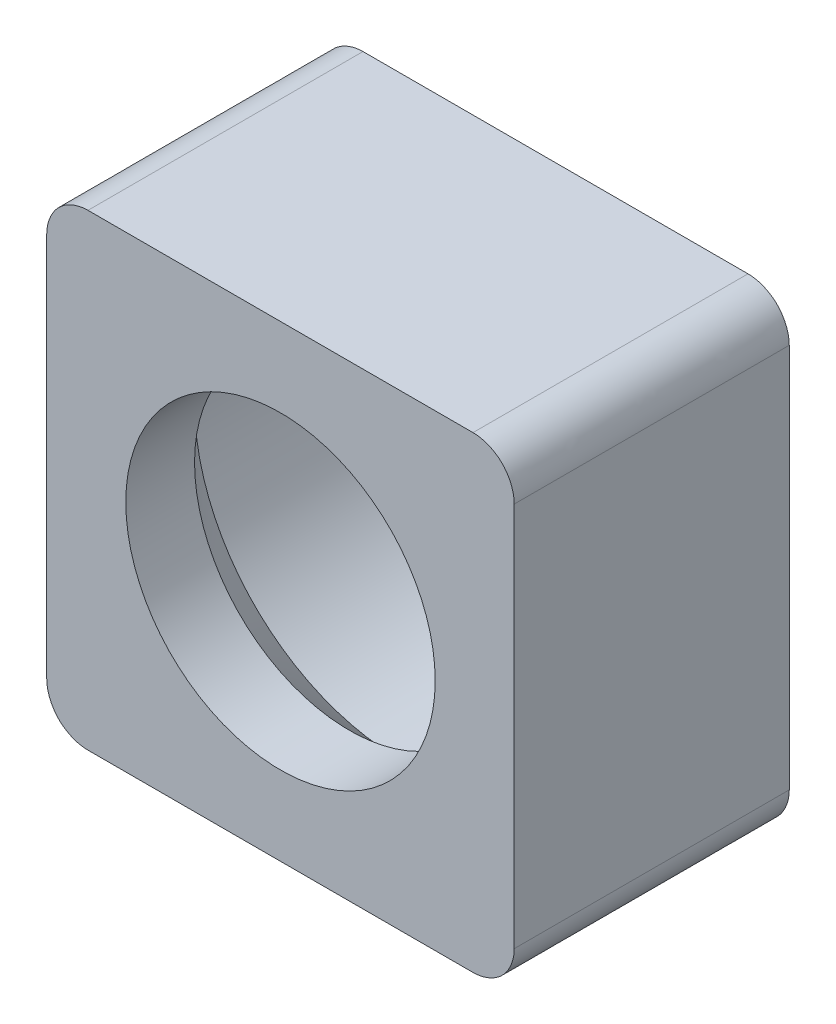
ISO-10303-21;
HEADER;
FILE_DESCRIPTION(('STEP AP214'),'2;1');
FILE_NAME('part.step','',(''),(''),'','','');
FILE_SCHEMA(('AUTOMOTIVE_DESIGN { 1 0 10303 214 1 1 1 1 }'));
ENDSEC;
DATA;
#1=APPLICATION_CONTEXT('core data for automotive mechanical design processes');
#2=APPLICATION_PROTOCOL_DEFINITION('international standard','automotive_design',2000,#1);
#3=PRODUCT_CONTEXT('',#1,'mechanical');
#4=PRODUCT('Part','Part','',(#3));
#5=PRODUCT_RELATED_PRODUCT_CATEGORY('part','',(#4));
#6=PRODUCT_DEFINITION_FORMATION('','',#4);
#7=PRODUCT_DEFINITION_CONTEXT('part definition',#1,'design');
#8=PRODUCT_DEFINITION('design','',#6,#7);
#9=PRODUCT_DEFINITION_SHAPE('','',#8);
#10=(LENGTH_UNIT() NAMED_UNIT(*) SI_UNIT(.MILLI.,.METRE.));
#11=(NAMED_UNIT(*) PLANE_ANGLE_UNIT() SI_UNIT($,.RADIAN.));
#12=(NAMED_UNIT(*) SI_UNIT($,.STERADIAN.) SOLID_ANGLE_UNIT());
#13=UNCERTAINTY_MEASURE_WITH_UNIT(LENGTH_MEASURE(1.E-05),#10,'distance_accuracy_value','');
#14=(GEOMETRIC_REPRESENTATION_CONTEXT(3) GLOBAL_UNCERTAINTY_ASSIGNED_CONTEXT((#13)) GLOBAL_UNIT_ASSIGNED_CONTEXT((#10,
#11,#12)) REPRESENTATION_CONTEXT('',''));
#15=CARTESIAN_POINT('',(0.,0.,0.));
#16=DIRECTION('',(0.,0.,1.));
#17=DIRECTION('',(1.,0.,0.));
#18=AXIS2_PLACEMENT_3D('',#15,#16,#17);
#19=CARTESIAN_POINT('',(0.,0.,-6.36396103067893));
#20=DIRECTION('',(0.,0.,1.));
#21=DIRECTION('',(1.,0.,0.));
#22=AXIS2_PLACEMENT_3D('',#19,#20,#21);
#23=CYLINDRICAL_SURFACE('',#22,2.25);
#24=CARTESIAN_POINT('',(0.,0.,3.00000000000001));
#25=DIRECTION('',(0.,0.,-1.));
#26=DIRECTION('',(-1.,0.,0.));
#27=AXIS2_PLACEMENT_3D('',#24,#25,#26);
#28=CIRCLE('',#27,2.25);
#29=CARTESIAN_POINT('',(-2.25,0.,3.00000000000001));
#30=VERTEX_POINT('',#29);
#31=EDGE_CURVE('E43',#30,#30,#28,.T.);
#32=ORIENTED_EDGE('',*,*,#31,.T.);
#33=EDGE_LOOP('',(#32));
#34=FACE_BOUND('',#33,.T.);
#35=CARTESIAN_POINT('',(0.,0.,4.));
#36=DIRECTION('',(0.,0.,1.));
#37=DIRECTION('',(1.,0.,0.));
#38=AXIS2_PLACEMENT_3D('',#35,#36,#37);
#39=CIRCLE('',#38,2.25);
#40=CARTESIAN_POINT('',(2.25,0.,4.));
#41=VERTEX_POINT('',#40);
#42=EDGE_CURVE('E184',#41,#41,#39,.T.);
#43=ORIENTED_EDGE('',*,*,#42,.T.);
#44=EDGE_LOOP('',(#43));
#45=FACE_BOUND('',#44,.T.);
#46=ADVANCED_FACE('F34',(#34,#45),#23,.F.);
#47=CARTESIAN_POINT('',(-2.79989338457967,3.40000000000003,4.));
#48=CARTESIAN_POINT('',(-2.95296602899174,3.40000000000008,4.));
#49=CARTESIAN_POINT('',(-3.27188283407694,3.27198446625344,4.));
#50=CARTESIAN_POINT('',(-3.39988196149886,2.95307118720388,4.));
#51=CARTESIAN_POINT('',(-3.3998819614989,2.80000000000004,4.));
#52=B_SPLINE_CURVE_WITH_KNOTS('',3,(#47,#48,#49,#50,#51),.UNSPECIFIED.,.F.,.F.,(4,1,4),
(-3.14159265358977,-2.35619449019233,-1.57079632679489),.UNSPECIFIED.);
#53=DIRECTION('',(0.,0.,-1.));
#54=VECTOR('',#53,1.);
#55=SURFACE_OF_LINEAR_EXTRUSION('',#52,#54);
#56=CARTESIAN_POINT('',(-2.79989338457967,3.40000000000003,0.));
#57=CARTESIAN_POINT('',(-2.95296602899174,3.40000000000008,0.));
#58=CARTESIAN_POINT('',(-3.27188283407694,3.27198446625344,0.));
#59=CARTESIAN_POINT('',(-3.39988196149886,2.95307118720388,0.));
#60=CARTESIAN_POINT('',(-3.3998819614989,2.80000000000004,0.));
#61=B_SPLINE_CURVE_WITH_KNOTS('',3,(#56,#57,#58,#59,#60),.UNSPECIFIED.,.F.,.F.,(4,1,4),
(-3.14159265358977,-2.35619449019233,-1.57079632679489),.UNSPECIFIED.);
#62=CARTESIAN_POINT('',(-2.79989338457967,3.4,0.));
#63=VERTEX_POINT('',#62);
#64=CARTESIAN_POINT('',(-3.3998819614989,2.80000000000004,0.));
#65=VERTEX_POINT('',#64);
#66=EDGE_CURVE('E190',#63,#65,#61,.T.);
#67=ORIENTED_EDGE('',*,*,#66,.T.);
#68=DIRECTION('',(0.,0.,-1.));
#69=VECTOR('',#68,1.);
#70=CARTESIAN_POINT('',(-3.3998819614989,2.80000000000004,4.));
#71=LINE('',#70,#69);
#72=CARTESIAN_POINT('',(-3.3998819614989,2.80000000000004,4.));
#73=VERTEX_POINT('',#72);
#74=EDGE_CURVE('E248',#73,#65,#71,.T.);
#75=ORIENTED_EDGE('',*,*,#74,.F.);
#76=CARTESIAN_POINT('',(-2.79989338457967,3.4,4.));
#77=VERTEX_POINT('',#76);
#78=EDGE_CURVE('E179',#77,#73,#52,.T.);
#79=ORIENTED_EDGE('',*,*,#78,.F.);
#80=DIRECTION('',(0.,0.,-1.));
#81=VECTOR('',#80,1.);
#82=CARTESIAN_POINT('',(-2.79989338457967,3.4,4.));
#83=LINE('',#82,#81);
#84=EDGE_CURVE('E128',#77,#63,#83,.T.);
#85=ORIENTED_EDGE('',*,*,#84,.T.);
#86=EDGE_LOOP('',(#67,#75,#79,#85));
#87=FACE_BOUND('',#86,.T.);
#88=ADVANCED_FACE('F176',(#87),#55,.F.);
#89=CARTESIAN_POINT('',(-3.3998819614989,2.80000000000004,4.));
#90=DIRECTION('',(1.,0.,0.));
#91=DIRECTION('',(0.,1.,0.));
#92=AXIS2_PLACEMENT_3D('',#89,#90,#91);
#93=PLANE('',#92);
#94=DIRECTION('',(0.,-1.,0.));
#95=VECTOR('',#94,1.);
#96=CARTESIAN_POINT('',(-3.3998819614989,2.80000000000004,0.));
#97=LINE('',#96,#95);
#98=CARTESIAN_POINT('',(-3.39988196149889,-2.80000000000004,0.));
#99=VERTEX_POINT('',#98);
#100=EDGE_CURVE('E203',#65,#99,#97,.T.);
#101=ORIENTED_EDGE('',*,*,#100,.T.);
#102=DIRECTION('',(0.,0.,-1.));
#103=VECTOR('',#102,1.);
#104=CARTESIAN_POINT('',(-3.39988196149889,-2.80000000000004,4.));
#105=LINE('',#104,#103);
#106=CARTESIAN_POINT('',(-3.39988196149889,-2.80000000000004,4.));
#107=VERTEX_POINT('',#106);
#108=EDGE_CURVE('E245',#107,#99,#105,.T.);
#109=ORIENTED_EDGE('',*,*,#108,.F.);
#110=DIRECTION('',(0.,-1.,0.));
#111=VECTOR('',#110,1.);
#112=CARTESIAN_POINT('',(-3.3998819614989,2.80000000000004,4.));
#113=LINE('',#112,#111);
#114=EDGE_CURVE('E95',#73,#107,#113,.T.);
#115=ORIENTED_EDGE('',*,*,#114,.F.);
#116=ORIENTED_EDGE('',*,*,#74,.T.);
#117=EDGE_LOOP('',(#101,#109,#115,#116));
#118=FACE_BOUND('',#117,.T.);
#119=ADVANCED_FACE('F173',(#118),#93,.F.);
#120=CARTESIAN_POINT('',(-3.3998819614989,-2.80000000000004,4.));
#121=CARTESIAN_POINT('',(-3.39988196149896,-2.95307118720388,4.));
#122=CARTESIAN_POINT('',(-3.27188283407687,-3.27198446625344,4.));
#123=CARTESIAN_POINT('',(-2.95296602899173,-3.40000000000003,4.));
#124=CARTESIAN_POINT('',(-2.79989338457965,-3.40000000000008,4.));
#125=B_SPLINE_CURVE_WITH_KNOTS('',3,(#120,#121,#122,#123,#124),.UNSPECIFIED.,.F.,.F.,(4,1,4),
(-1.57079632679526,-0.785398163397782,-3.00696852117388E-13),.UNSPECIFIED.);
#126=DIRECTION('',(0.,0.,-1.));
#127=VECTOR('',#126,1.);
#128=SURFACE_OF_LINEAR_EXTRUSION('',#125,#127);
#129=CARTESIAN_POINT('',(-3.3998819614989,-2.80000000000004,0.));
#130=CARTESIAN_POINT('',(-3.39988196149896,-2.95307118720388,0.));
#131=CARTESIAN_POINT('',(-3.27188283407687,-3.27198446625344,0.));
#132=CARTESIAN_POINT('',(-2.95296602899173,-3.40000000000003,0.));
#133=CARTESIAN_POINT('',(-2.79989338457965,-3.40000000000008,0.));
#134=B_SPLINE_CURVE_WITH_KNOTS('',3,(#129,#130,#131,#132,#133),.UNSPECIFIED.,.F.,.F.,(4,1,4),
(-1.57079632679526,-0.785398163397782,-3.00696852117388E-13),.UNSPECIFIED.);
#135=CARTESIAN_POINT('',(-2.79989338457965,-3.40000000000008,0.));
#136=VERTEX_POINT('',#135);
#137=EDGE_CURVE('E205',#99,#136,#134,.T.);
#138=ORIENTED_EDGE('',*,*,#137,.T.);
#139=DIRECTION('',(0.,0.,-1.));
#140=VECTOR('',#139,1.);
#141=CARTESIAN_POINT('',(-2.79989338457965,-3.40000000000008,4.));
#142=LINE('',#141,#140);
#143=CARTESIAN_POINT('',(-2.79989338457965,-3.40000000000008,4.));
#144=VERTEX_POINT('',#143);
#145=EDGE_CURVE('E242',#144,#136,#142,.T.);
#146=ORIENTED_EDGE('',*,*,#145,.F.);
#147=EDGE_CURVE('E161',#107,#144,#125,.T.);
#148=ORIENTED_EDGE('',*,*,#147,.F.);
#149=ORIENTED_EDGE('',*,*,#108,.T.);
#150=EDGE_LOOP('',(#138,#146,#148,#149));
#151=FACE_BOUND('',#150,.T.);
#152=ADVANCED_FACE('F170',(#151),#128,.F.);
#153=CARTESIAN_POINT('',(-2.79989338457967,-3.40000000000003,4.));
#154=DIRECTION('',(0.,1.,0.));
#155=DIRECTION('',(-1.,0.,0.));
#156=AXIS2_PLACEMENT_3D('',#153,#154,#155);
#157=PLANE('',#156);
#158=DIRECTION('',(1.,0.,0.));
#159=VECTOR('',#158,1.);
#160=CARTESIAN_POINT('',(-2.79989338457967,-3.40000000000003,0.));
#161=LINE('',#160,#159);
#162=CARTESIAN_POINT('',(2.79989338457971,-3.40000000000008,0.));
#163=VERTEX_POINT('',#162);
#164=EDGE_CURVE('E216',#136,#163,#161,.T.);
#165=ORIENTED_EDGE('',*,*,#164,.T.);
#166=DIRECTION('',(0.,0.,-1.));
#167=VECTOR('',#166,1.);
#168=CARTESIAN_POINT('',(2.79989338457971,-3.40000000000008,4.));
#169=LINE('',#168,#167);
#170=CARTESIAN_POINT('',(2.79989338457971,-3.40000000000008,4.));
#171=VERTEX_POINT('',#170);
#172=EDGE_CURVE('E239',#171,#163,#169,.T.);
#173=ORIENTED_EDGE('',*,*,#172,.F.);
#174=DIRECTION('',(1.,0.,0.));
#175=VECTOR('',#174,1.);
#176=CARTESIAN_POINT('',(-2.79989338457967,-3.40000000000003,4.));
#177=LINE('',#176,#175);
#178=EDGE_CURVE('E156',#144,#171,#177,.T.);
#179=ORIENTED_EDGE('',*,*,#178,.F.);
#180=ORIENTED_EDGE('',*,*,#145,.T.);
#181=EDGE_LOOP('',(#165,#173,#179,#180));
#182=FACE_BOUND('',#181,.T.);
#183=ADVANCED_FACE('F149',(#182),#157,.F.);
#184=CARTESIAN_POINT('',(2.79989338457971,-3.40000000000008,4.));
#185=CARTESIAN_POINT('',(2.95296602899178,-3.40000000000007,4.));
#186=CARTESIAN_POINT('',(3.27188283407693,-3.27198446625344,4.));
#187=CARTESIAN_POINT('',(3.39988196149893,-2.95307118720388,4.));
#188=CARTESIAN_POINT('',(3.39988196149891,-2.80000000000004,4.));
#189=B_SPLINE_CURVE_WITH_KNOTS('',3,(#184,#185,#186,#187,#188),.UNSPECIFIED.,.F.,.F.,(4,1,4),
(0.,0.785398163397447,1.57079632679489),.UNSPECIFIED.);
#190=DIRECTION('',(0.,0.,-1.));
#191=VECTOR('',#190,1.);
#192=SURFACE_OF_LINEAR_EXTRUSION('',#189,#191);
#193=CARTESIAN_POINT('',(2.79989338457971,-3.40000000000008,0.));
#194=CARTESIAN_POINT('',(2.95296602899178,-3.40000000000007,0.));
#195=CARTESIAN_POINT('',(3.27188283407693,-3.27198446625344,0.));
#196=CARTESIAN_POINT('',(3.39988196149893,-2.95307118720388,0.));
#197=CARTESIAN_POINT('',(3.39988196149891,-2.80000000000004,0.));
#198=B_SPLINE_CURVE_WITH_KNOTS('',3,(#193,#194,#195,#196,#197),.UNSPECIFIED.,.F.,.F.,(4,1,4),
(0.,0.785398163397447,1.57079632679489),.UNSPECIFIED.);
#199=CARTESIAN_POINT('',(3.39988196149891,-2.80000000000004,0.));
#200=VERTEX_POINT('',#199);
#201=EDGE_CURVE('E221',#163,#200,#198,.T.);
#202=ORIENTED_EDGE('',*,*,#201,.T.);
#203=DIRECTION('',(0.,0.,-1.));
#204=VECTOR('',#203,1.);
#205=CARTESIAN_POINT('',(3.39988196149891,-2.80000000000004,4.));
#206=LINE('',#205,#204);
#207=CARTESIAN_POINT('',(3.39988196149891,-2.80000000000004,4.));
#208=VERTEX_POINT('',#207);
#209=EDGE_CURVE('E123',#208,#200,#206,.T.);
#210=ORIENTED_EDGE('',*,*,#209,.F.);
#211=EDGE_CURVE('E114',#171,#208,#189,.T.);
#212=ORIENTED_EDGE('',*,*,#211,.F.);
#213=ORIENTED_EDGE('',*,*,#172,.T.);
#214=EDGE_LOOP('',(#202,#210,#212,#213));
#215=FACE_BOUND('',#214,.T.);
#216=ADVANCED_FACE('F146',(#215),#192,.F.);
#217=CARTESIAN_POINT('',(3.39988196149895,-2.80000000000001,4.));
#218=DIRECTION('',(-1.,0.,0.));
#219=DIRECTION('',(0.,-1.,0.));
#220=AXIS2_PLACEMENT_3D('',#217,#218,#219);
#221=PLANE('',#220);
#222=DIRECTION('',(0.,1.,0.));
#223=VECTOR('',#222,1.);
#224=CARTESIAN_POINT('',(3.39988196149895,-2.80000000000001,0.));
#225=LINE('',#224,#223);
#226=CARTESIAN_POINT('',(3.39988196149893,2.79999999999997,0.));
#227=VERTEX_POINT('',#226);
#228=EDGE_CURVE('E122',#200,#227,#225,.T.);
#229=ORIENTED_EDGE('',*,*,#228,.T.);
#230=DIRECTION('',(0.,0.,-1.));
#231=VECTOR('',#230,1.);
#232=CARTESIAN_POINT('',(3.39988196149893,2.79999999999997,4.));
#233=LINE('',#232,#231);
#234=CARTESIAN_POINT('',(3.39988196149893,2.79999999999997,4.));
#235=VERTEX_POINT('',#234);
#236=EDGE_CURVE('E119',#235,#227,#233,.T.);
#237=ORIENTED_EDGE('',*,*,#236,.F.);
#238=DIRECTION('',(0.,1.,0.));
#239=VECTOR('',#238,1.);
#240=CARTESIAN_POINT('',(3.39988196149895,-2.80000000000001,4.));
#241=LINE('',#240,#239);
#242=EDGE_CURVE('E108',#208,#235,#241,.T.);
#243=ORIENTED_EDGE('',*,*,#242,.F.);
#244=ORIENTED_EDGE('',*,*,#209,.T.);
#245=EDGE_LOOP('',(#229,#237,#243,#244));
#246=FACE_BOUND('',#245,.T.);
#247=ADVANCED_FACE('F120',(#246),#221,.F.);
#248=CARTESIAN_POINT('',(3.39988196149893,2.79999999999997,4.));
#249=CARTESIAN_POINT('',(3.39988196149892,2.95307118720381,4.));
#250=CARTESIAN_POINT('',(3.27188283407692,3.27198446625343,4.));
#251=CARTESIAN_POINT('',(2.95296602899178,3.40000000000001,4.));
#252=CARTESIAN_POINT('',(2.79989338457971,3.40000000000003,4.));
#253=B_SPLINE_CURVE_WITH_KNOTS('',3,(#248,#249,#250,#251,#252),.UNSPECIFIED.,.F.,.F.,(4,1,4),
(1.57079632679488,2.35619449019234,3.14159265358979),.UNSPECIFIED.);
#254=DIRECTION('',(0.,0.,-1.));
#255=VECTOR('',#254,1.);
#256=SURFACE_OF_LINEAR_EXTRUSION('',#253,#255);
#257=CARTESIAN_POINT('',(3.39988196149893,2.79999999999997,0.));
#258=CARTESIAN_POINT('',(3.39988196149892,2.95307118720381,0.));
#259=CARTESIAN_POINT('',(3.27188283407692,3.27198446625343,0.));
#260=CARTESIAN_POINT('',(2.95296602899178,3.40000000000001,0.));
#261=CARTESIAN_POINT('',(2.79989338457971,3.40000000000003,0.));
#262=B_SPLINE_CURVE_WITH_KNOTS('',3,(#257,#258,#259,#260,#261),.UNSPECIFIED.,.F.,.F.,(4,1,4),
(1.57079632679488,2.35619449019234,3.14159265358979),.UNSPECIFIED.);
#263=CARTESIAN_POINT('',(2.79989338457971,3.40000000000003,0.));
#264=VERTEX_POINT('',#263);
#265=EDGE_CURVE('E80',#227,#264,#262,.T.);
#266=ORIENTED_EDGE('',*,*,#265,.T.);
#267=DIRECTION('',(0.,0.,-1.));
#268=VECTOR('',#267,1.);
#269=CARTESIAN_POINT('',(2.79989338457971,3.40000000000003,4.));
#270=LINE('',#269,#268);
#271=CARTESIAN_POINT('',(2.79989338457971,3.40000000000003,4.));
#272=VERTEX_POINT('',#271);
#273=EDGE_CURVE('E124',#272,#264,#270,.T.);
#274=ORIENTED_EDGE('',*,*,#273,.F.);
#275=EDGE_CURVE('E112',#235,#272,#253,.T.);
#276=ORIENTED_EDGE('',*,*,#275,.F.);
#277=ORIENTED_EDGE('',*,*,#236,.T.);
#278=EDGE_LOOP('',(#266,#274,#276,#277));
#279=FACE_BOUND('',#278,.T.);
#280=ADVANCED_FACE('F126',(#279),#256,.F.);
#281=CARTESIAN_POINT('',(2.79989338457971,3.39999999999999,4.));
#282=DIRECTION('',(0.,-1.,0.));
#283=DIRECTION('',(1.,0.,0.));
#284=AXIS2_PLACEMENT_3D('',#281,#282,#283);
#285=PLANE('',#284);
#286=DIRECTION('',(-1.,0.,0.));
#287=VECTOR('',#286,1.);
#288=CARTESIAN_POINT('',(2.79989338457971,3.39999999999999,0.));
#289=LINE('',#288,#287);
#290=EDGE_CURVE('E86',#264,#63,#289,.T.);
#291=ORIENTED_EDGE('',*,*,#290,.T.);
#292=ORIENTED_EDGE('',*,*,#84,.F.);
#293=DIRECTION('',(-1.,0.,0.));
#294=VECTOR('',#293,1.);
#295=CARTESIAN_POINT('',(2.79989338457971,3.39999999999999,4.));
#296=LINE('',#295,#294);
#297=EDGE_CURVE('E51',#272,#77,#296,.T.);
#298=ORIENTED_EDGE('',*,*,#297,.F.);
#299=ORIENTED_EDGE('',*,*,#273,.T.);
#300=EDGE_LOOP('',(#291,#292,#298,#299));
#301=FACE_BOUND('',#300,.T.);
#302=ADVANCED_FACE('F142',(#301),#285,.F.);
#303=CARTESIAN_POINT('',(-3.22415341466112,3.22426002992771,4.));
#304=DIRECTION('',(0.,0.,-1.));
#305=DIRECTION('',(-1.,0.,0.));
#306=AXIS2_PLACEMENT_3D('',#303,#304,#305);
#307=PLANE('',#306);
#308=ORIENTED_EDGE('',*,*,#42,.F.);
#309=EDGE_LOOP('',(#308));
#310=FACE_BOUND('',#309,.T.);
#311=ORIENTED_EDGE('',*,*,#78,.T.);
#312=ORIENTED_EDGE('',*,*,#114,.T.);
#313=ORIENTED_EDGE('',*,*,#147,.T.);
#314=ORIENTED_EDGE('',*,*,#178,.T.);
#315=ORIENTED_EDGE('',*,*,#211,.T.);
#316=ORIENTED_EDGE('',*,*,#242,.T.);
#317=ORIENTED_EDGE('',*,*,#275,.T.);
#318=ORIENTED_EDGE('',*,*,#297,.T.);
#319=EDGE_LOOP('',(#311,#312,#313,#314,#315,#316,#317,#318));
#320=FACE_BOUND('',#319,.T.);
#321=ADVANCED_FACE('F110',(#310,#320),#307,.F.);
#322=CARTESIAN_POINT('',(-3.22415341466112,3.22426002992771,0.));
#323=DIRECTION('',(0.,0.,-1.));
#324=DIRECTION('',(-1.,0.,0.));
#325=AXIS2_PLACEMENT_3D('',#322,#323,#324);
#326=PLANE('',#325);
#327=CARTESIAN_POINT('',(0.,0.,0.));
#328=DIRECTION('',(0.,0.,-1.));
#329=DIRECTION('',(-1.,0.,0.));
#330=AXIS2_PLACEMENT_3D('',#327,#328,#329);
#331=CIRCLE('',#330,3.);
#332=CARTESIAN_POINT('',(-3.,0.,0.));
#333=VERTEX_POINT('',#332);
#334=EDGE_CURVE('E191',#333,#333,#331,.T.);
#335=ORIENTED_EDGE('',*,*,#334,.F.);
#336=EDGE_LOOP('',(#335));
#337=FACE_BOUND('',#336,.T.);
#338=ORIENTED_EDGE('',*,*,#66,.F.);
#339=ORIENTED_EDGE('',*,*,#290,.F.);
#340=ORIENTED_EDGE('',*,*,#265,.F.);
#341=ORIENTED_EDGE('',*,*,#228,.F.);
#342=ORIENTED_EDGE('',*,*,#201,.F.);
#343=ORIENTED_EDGE('',*,*,#164,.F.);
#344=ORIENTED_EDGE('',*,*,#137,.F.);
#345=ORIENTED_EDGE('',*,*,#100,.F.);
#346=EDGE_LOOP('',(#338,#339,#340,#341,#342,#343,#344,#345));
#347=FACE_BOUND('',#346,.T.);
#348=ADVANCED_FACE('F197',(#337,#347),#326,.T.);
#349=CARTESIAN_POINT('',(0.,0.,2.));
#350=DIRECTION('',(0.,0.,-1.));
#351=DIRECTION('',(-1.,0.,0.));
#352=AXIS2_PLACEMENT_3D('',#349,#350,#351);
#353=CYLINDRICAL_SURFACE('',#352,3.);
#354=CARTESIAN_POINT('',(0.,0.,2.25000000000001));
#355=DIRECTION('',(0.,0.,-1.));
#356=DIRECTION('',(-1.,0.,0.));
#357=AXIS2_PLACEMENT_3D('',#354,#355,#356);
#358=CIRCLE('',#357,3.);
#359=CARTESIAN_POINT('',(-3.,0.,2.25000000000001));
#360=VERTEX_POINT('',#359);
#361=EDGE_CURVE('E11',#360,#360,#358,.F.);
#362=ORIENTED_EDGE('',*,*,#361,.T.);
#363=EDGE_LOOP('',(#362));
#364=FACE_BOUND('',#363,.T.);
#365=ORIENTED_EDGE('',*,*,#334,.T.);
#366=EDGE_LOOP('',(#365));
#367=FACE_BOUND('',#366,.T.);
#368=ADVANCED_FACE('F195',(#364,#367),#353,.F.);
#369=CARTESIAN_POINT('',(0.,0.,2.));
#370=DIRECTION('',(0.,0.,-1.));
#371=DIRECTION('',(-1.,0.,0.));
#372=AXIS2_PLACEMENT_3D('',#369,#370,#371);
#373=CONICAL_SURFACE('',#372,3.25000000000002,0.785398163397453);
#374=ORIENTED_EDGE('',*,*,#31,.F.);
#375=EDGE_LOOP('',(#374));
#376=FACE_BOUND('',#375,.T.);
#377=ORIENTED_EDGE('',*,*,#361,.F.);
#378=EDGE_LOOP('',(#377));
#379=FACE_BOUND('',#378,.T.);
#380=ADVANCED_FACE('F36',(#376,#379),#373,.F.);
#381=CLOSED_SHELL('',(#46,#88,#119,#152,#183,#216,#247,#280,#302,#321,#348,#368,#380));
#382=MANIFOLD_SOLID_BREP('B2',#381);
#383=ADVANCED_BREP_SHAPE_REPRESENTATION('',(#18,#382),#14);
#384=SHAPE_DEFINITION_REPRESENTATION(#9,#383);
ENDSEC;
END-ISO-10303-21;
